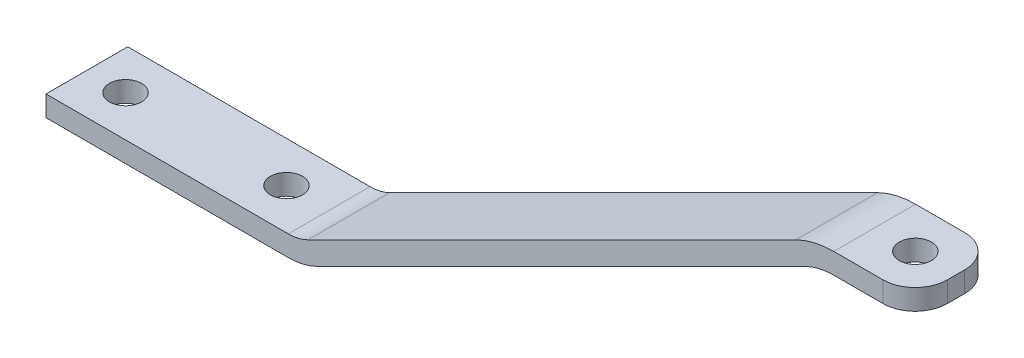
ISO-10303-21;
HEADER;
FILE_DESCRIPTION(('STEP AP214'),'2;1');
FILE_NAME('part.step','',(''),(''),'','','');
FILE_SCHEMA(('AUTOMOTIVE_DESIGN { 1 0 10303 214 1 1 1 1 }'));
ENDSEC;
DATA;
#1=APPLICATION_CONTEXT('core data for automotive mechanical design processes');
#2=APPLICATION_PROTOCOL_DEFINITION('international standard','automotive_design',2000,#1);
#3=PRODUCT_CONTEXT('',#1,'mechanical');
#4=PRODUCT('Part','Part','',(#3));
#5=PRODUCT_RELATED_PRODUCT_CATEGORY('part','',(#4));
#6=PRODUCT_DEFINITION_FORMATION('','',#4);
#7=PRODUCT_DEFINITION_CONTEXT('part definition',#1,'design');
#8=PRODUCT_DEFINITION('design','',#6,#7);
#9=PRODUCT_DEFINITION_SHAPE('','',#8);
#10=(LENGTH_UNIT() NAMED_UNIT(*) SI_UNIT(.MILLI.,.METRE.));
#11=(NAMED_UNIT(*) PLANE_ANGLE_UNIT() SI_UNIT($,.RADIAN.));
#12=(NAMED_UNIT(*) SI_UNIT($,.STERADIAN.) SOLID_ANGLE_UNIT());
#13=UNCERTAINTY_MEASURE_WITH_UNIT(LENGTH_MEASURE(1.E-05),#10,'distance_accuracy_value','');
#14=(GEOMETRIC_REPRESENTATION_CONTEXT(3) GLOBAL_UNCERTAINTY_ASSIGNED_CONTEXT((#13)) GLOBAL_UNIT_ASSIGNED_CONTEXT((#10,
#11,#12)) REPRESENTATION_CONTEXT('',''));
#15=CARTESIAN_POINT('',(0.,0.,0.));
#16=DIRECTION('',(0.,0.,1.));
#17=DIRECTION('',(1.,0.,0.));
#18=AXIS2_PLACEMENT_3D('',#15,#16,#17);
#19=CARTESIAN_POINT('',(0.,0.,12.7));
#20=DIRECTION('',(-1.,0.,0.));
#21=DIRECTION('',(0.,0.,1.));
#22=AXIS2_PLACEMENT_3D('',#19,#20,#21);
#23=PLANE('',#22);
#24=DIRECTION('',(0.,1.,0.));
#25=VECTOR('',#24,1.);
#26=CARTESIAN_POINT('',(0.,0.,0.));
#27=LINE('',#26,#25);
#28=CARTESIAN_POINT('',(0.,0.,0.));
#29=VERTEX_POINT('',#28);
#30=CARTESIAN_POINT('',(0.,3.2,0.));
#31=VERTEX_POINT('',#30);
#32=EDGE_CURVE('E191',#29,#31,#27,.T.);
#33=ORIENTED_EDGE('',*,*,#32,.F.);
#34=DIRECTION('',(0.,0.,-1.));
#35=VECTOR('',#34,1.);
#36=CARTESIAN_POINT('',(0.,0.,12.7));
#37=LINE('',#36,#35);
#38=CARTESIAN_POINT('',(0.,0.,12.7));
#39=VERTEX_POINT('',#38);
#40=EDGE_CURVE('E160',#39,#29,#37,.T.);
#41=ORIENTED_EDGE('',*,*,#40,.F.);
#42=DIRECTION('',(0.,1.,0.));
#43=VECTOR('',#42,1.);
#44=CARTESIAN_POINT('',(0.,0.,12.7));
#45=LINE('',#44,#43);
#46=CARTESIAN_POINT('',(0.,3.2,12.7));
#47=VERTEX_POINT('',#46);
#48=EDGE_CURVE('E154',#39,#47,#45,.T.);
#49=ORIENTED_EDGE('',*,*,#48,.T.);
#50=DIRECTION('',(0.,0.,-1.));
#51=VECTOR('',#50,1.);
#52=CARTESIAN_POINT('',(0.,3.2,12.7));
#53=LINE('',#52,#51);
#54=EDGE_CURVE('E137',#47,#31,#53,.T.);
#55=ORIENTED_EDGE('',*,*,#54,.T.);
#56=EDGE_LOOP('',(#33,#41,#49,#55));
#57=FACE_BOUND('',#56,.T.);
#58=ADVANCED_FACE('F36',(#57),#23,.T.);
#59=CARTESIAN_POINT('',(0.,0.,12.7));
#60=DIRECTION('',(0.,1.,0.));
#61=DIRECTION('',(0.,0.,1.));
#62=AXIS2_PLACEMENT_3D('',#59,#60,#61);
#63=PLANE('',#62);
#64=CARTESIAN_POINT('',(31.,0.,6.35));
#65=DIRECTION('',(0.,1.,0.));
#66=DIRECTION('',(0.,0.,1.));
#67=AXIS2_PLACEMENT_3D('',#64,#65,#66);
#68=CIRCLE('',#67,2.49999999999999);
#69=CARTESIAN_POINT('',(31.,0.,8.84999999999999));
#70=VERTEX_POINT('',#69);
#71=EDGE_CURVE('E193',#70,#70,#68,.T.);
#72=ORIENTED_EDGE('',*,*,#71,.T.);
#73=EDGE_LOOP('',(#72));
#74=FACE_BOUND('',#73,.T.);
#75=CARTESIAN_POINT('',(6.,0.,6.35));
#76=DIRECTION('',(0.,1.,0.));
#77=DIRECTION('',(0.,0.,1.));
#78=AXIS2_PLACEMENT_3D('',#75,#76,#77);
#79=CIRCLE('',#78,2.5);
#80=CARTESIAN_POINT('',(6.,0.,8.85));
#81=VERTEX_POINT('',#80);
#82=EDGE_CURVE('E344',#81,#81,#79,.T.);
#83=ORIENTED_EDGE('',*,*,#82,.T.);
#84=EDGE_LOOP('',(#83));
#85=FACE_BOUND('',#84,.T.);
#86=DIRECTION('',(1.,0.,0.));
#87=VECTOR('',#86,1.);
#88=CARTESIAN_POINT('',(0.,0.,0.));
#89=LINE('',#88,#87);
#90=CARTESIAN_POINT('',(37.6393202250021,0.,0.));
#91=VERTEX_POINT('',#90);
#92=EDGE_CURVE('E162',#29,#91,#89,.T.);
#93=ORIENTED_EDGE('',*,*,#92,.T.);
#94=DIRECTION('',(0.,0.,-1.));
#95=VECTOR('',#94,1.);
#96=CARTESIAN_POINT('',(37.6393202250021,0.,12.7));
#97=LINE('',#96,#95);
#98=CARTESIAN_POINT('',(37.6393202250021,0.,12.7));
#99=VERTEX_POINT('',#98);
#100=EDGE_CURVE('E216',#99,#91,#97,.T.);
#101=ORIENTED_EDGE('',*,*,#100,.F.);
#102=DIRECTION('',(1.,0.,0.));
#103=VECTOR('',#102,1.);
#104=CARTESIAN_POINT('',(0.,0.,12.7));
#105=LINE('',#104,#103);
#106=EDGE_CURVE('E148',#39,#99,#105,.T.);
#107=ORIENTED_EDGE('',*,*,#106,.F.);
#108=ORIENTED_EDGE('',*,*,#40,.T.);
#109=EDGE_LOOP('',(#93,#101,#107,#108));
#110=FACE_BOUND('',#109,.T.);
#111=ADVANCED_FACE('F275',(#74,#85,#110),#63,.F.);
#112=CARTESIAN_POINT('',(37.6393202250021,10.,12.7));
#113=DIRECTION('',(0.,0.,-1.));
#114=DIRECTION('',(-1.,0.,0.));
#115=AXIS2_PLACEMENT_3D('',#112,#113,#114);
#116=CYLINDRICAL_SURFACE('',#115,10.);
#117=CARTESIAN_POINT('',(37.6393202250021,10.,0.));
#118=DIRECTION('',(0.,0.,-1.));
#119=DIRECTION('',(-1.,0.,0.));
#120=AXIS2_PLACEMENT_3D('',#117,#118,#119);
#121=CIRCLE('',#120,10.);
#122=CARTESIAN_POINT('',(42.1114561800017,1.05572809000086,0.));
#123=VERTEX_POINT('',#122);
#124=EDGE_CURVE('E165',#123,#91,#121,.T.);
#125=ORIENTED_EDGE('',*,*,#124,.F.);
#126=DIRECTION('',(0.,0.,-1.));
#127=VECTOR('',#126,1.);
#128=CARTESIAN_POINT('',(42.1114561800017,1.05572809000086,12.7));
#129=LINE('',#128,#127);
#130=CARTESIAN_POINT('',(42.1114561800017,1.05572809000086,12.7));
#131=VERTEX_POINT('',#130);
#132=EDGE_CURVE('E218',#131,#123,#129,.T.);
#133=ORIENTED_EDGE('',*,*,#132,.F.);
#134=CARTESIAN_POINT('',(37.6393202250021,10.,12.7));
#135=DIRECTION('',(0.,0.,-1.));
#136=DIRECTION('',(-1.,0.,0.));
#137=AXIS2_PLACEMENT_3D('',#134,#135,#136);
#138=CIRCLE('',#137,10.);
#139=EDGE_CURVE('E187',#131,#99,#138,.T.);
#140=ORIENTED_EDGE('',*,*,#139,.T.);
#141=ORIENTED_EDGE('',*,*,#100,.T.);
#142=EDGE_LOOP('',(#125,#133,#140,#141));
#143=FACE_BOUND('',#142,.T.);
#144=ADVANCED_FACE('F280',(#143),#116,.T.);
#145=CARTESIAN_POINT('',(42.1114561800017,1.05572809000086,12.7));
#146=DIRECTION('',(-0.447213595499958,0.894427190999916,0.));
#147=DIRECTION('',(-0.894427190999916,-0.447213595499958,0.));
#148=AXIS2_PLACEMENT_3D('',#145,#146,#147);
#149=PLANE('',#148);
#150=DIRECTION('',(0.894427190999916,0.447213595499958,0.));
#151=VECTOR('',#150,1.);
#152=CARTESIAN_POINT('',(42.1114561800017,1.05572809000086,0.));
#153=LINE('',#152,#151);
#154=CARTESIAN_POINT('',(117.888543819998,38.9442719099991,0.));
#155=VERTEX_POINT('',#154);
#156=EDGE_CURVE('E210',#123,#155,#153,.T.);
#157=ORIENTED_EDGE('',*,*,#156,.T.);
#158=DIRECTION('',(0.,0.,-1.));
#159=VECTOR('',#158,1.);
#160=CARTESIAN_POINT('',(117.888543819998,38.9442719099991,12.7));
#161=LINE('',#160,#159);
#162=CARTESIAN_POINT('',(117.888543819998,38.9442719099991,12.7));
#163=VERTEX_POINT('',#162);
#164=EDGE_CURVE('E220',#163,#155,#161,.T.);
#165=ORIENTED_EDGE('',*,*,#164,.F.);
#166=DIRECTION('',(0.894427190999916,0.447213595499958,0.));
#167=VECTOR('',#166,1.);
#168=CARTESIAN_POINT('',(42.1114561800017,1.05572809000086,12.7));
#169=LINE('',#168,#167);
#170=EDGE_CURVE('E185',#131,#163,#169,.T.);
#171=ORIENTED_EDGE('',*,*,#170,.F.);
#172=ORIENTED_EDGE('',*,*,#132,.T.);
#173=EDGE_LOOP('',(#157,#165,#171,#172));
#174=FACE_BOUND('',#173,.T.);
#175=ADVANCED_FACE('F310',(#174),#149,.F.);
#176=CARTESIAN_POINT('',(122.360679774998,30.,12.7));
#177=DIRECTION('',(0.,0.,-1.));
#178=DIRECTION('',(-1.,0.,0.));
#179=AXIS2_PLACEMENT_3D('',#176,#177,#178);
#180=CYLINDRICAL_SURFACE('',#179,10.);
#181=CARTESIAN_POINT('',(122.360679774998,30.,0.));
#182=DIRECTION('',(0.,0.,-1.));
#183=DIRECTION('',(-1.,0.,0.));
#184=AXIS2_PLACEMENT_3D('',#181,#182,#183);
#185=CIRCLE('',#184,10.);
#186=CARTESIAN_POINT('',(122.360679774998,40.,0.));
#187=VERTEX_POINT('',#186);
#188=EDGE_CURVE('E208',#155,#187,#185,.T.);
#189=ORIENTED_EDGE('',*,*,#188,.T.);
#190=DIRECTION('',(0.,0.,-1.));
#191=VECTOR('',#190,1.);
#192=CARTESIAN_POINT('',(122.360679774998,40.,12.7));
#193=LINE('',#192,#191);
#194=CARTESIAN_POINT('',(122.360679774998,40.,12.7));
#195=VERTEX_POINT('',#194);
#196=EDGE_CURVE('E223',#195,#187,#193,.T.);
#197=ORIENTED_EDGE('',*,*,#196,.F.);
#198=CARTESIAN_POINT('',(122.360679774998,30.,12.7));
#199=DIRECTION('',(0.,0.,-1.));
#200=DIRECTION('',(-1.,0.,0.));
#201=AXIS2_PLACEMENT_3D('',#198,#199,#200);
#202=CIRCLE('',#201,10.);
#203=EDGE_CURVE('E183',#163,#195,#202,.T.);
#204=ORIENTED_EDGE('',*,*,#203,.F.);
#205=ORIENTED_EDGE('',*,*,#164,.T.);
#206=EDGE_LOOP('',(#189,#197,#204,#205));
#207=FACE_BOUND('',#206,.T.);
#208=ADVANCED_FACE('F306',(#207),#180,.F.);
#209=CARTESIAN_POINT('',(122.360679774998,40.,12.7));
#210=DIRECTION('',(0.,1.,0.));
#211=DIRECTION('',(0.,0.,1.));
#212=AXIS2_PLACEMENT_3D('',#209,#210,#211);
#213=PLANE('',#212);
#214=CARTESIAN_POINT('',(128.680339887499,40.,6.35));
#215=DIRECTION('',(0.,1.,0.));
#216=DIRECTION('',(0.,0.,1.));
#217=AXIS2_PLACEMENT_3D('',#214,#215,#216);
#218=CIRCLE('',#217,2.5);
#219=CARTESIAN_POINT('',(128.680339887499,40.,8.84999999999999));
#220=VERTEX_POINT('',#219);
#221=EDGE_CURVE('E341',#220,#220,#218,.T.);
#222=ORIENTED_EDGE('',*,*,#221,.T.);
#223=EDGE_LOOP('',(#222));
#224=FACE_BOUND('',#223,.T.);
#225=DIRECTION('',(1.,0.,0.));
#226=VECTOR('',#225,1.);
#227=CARTESIAN_POINT('',(122.360679774998,40.,0.));
#228=LINE('',#227,#226);
#229=CARTESIAN_POINT('',(130.,40.,0.));
#230=VERTEX_POINT('',#229);
#231=EDGE_CURVE('E206',#187,#230,#228,.T.);
#232=ORIENTED_EDGE('',*,*,#231,.T.);
#233=CARTESIAN_POINT('',(130.,40.,5.));
#234=DIRECTION('',(0.,1.,0.));
#235=DIRECTION('',(0.,0.,1.));
#236=AXIS2_PLACEMENT_3D('',#233,#234,#235);
#237=CIRCLE('',#236,5.);
#238=CARTESIAN_POINT('',(135.,40.,5.));
#239=VERTEX_POINT('',#238);
#240=EDGE_CURVE('E11',#230,#239,#237,.F.);
#241=ORIENTED_EDGE('',*,*,#240,.T.);
#242=DIRECTION('',(0.,0.,-1.));
#243=VECTOR('',#242,1.);
#244=CARTESIAN_POINT('',(135.,40.,12.7));
#245=LINE('',#244,#243);
#246=CARTESIAN_POINT('',(135.,40.,7.7));
#247=VERTEX_POINT('',#246);
#248=EDGE_CURVE('E226',#247,#239,#245,.T.);
#249=ORIENTED_EDGE('',*,*,#248,.F.);
#250=CARTESIAN_POINT('',(130.,40.,7.7));
#251=DIRECTION('',(0.,1.,0.));
#252=DIRECTION('',(0.,0.,1.));
#253=AXIS2_PLACEMENT_3D('',#250,#251,#252);
#254=CIRCLE('',#253,5.);
#255=CARTESIAN_POINT('',(130.,40.,12.7));
#256=VERTEX_POINT('',#255);
#257=EDGE_CURVE('E244',#247,#256,#254,.F.);
#258=ORIENTED_EDGE('',*,*,#257,.T.);
#259=DIRECTION('',(1.,0.,0.));
#260=VECTOR('',#259,1.);
#261=CARTESIAN_POINT('',(122.360679774998,40.,12.7));
#262=LINE('',#261,#260);
#263=EDGE_CURVE('E181',#195,#256,#262,.T.);
#264=ORIENTED_EDGE('',*,*,#263,.F.);
#265=ORIENTED_EDGE('',*,*,#196,.T.);
#266=EDGE_LOOP('',(#232,#241,#249,#258,#264,#265));
#267=FACE_BOUND('',#266,.T.);
#268=ADVANCED_FACE('F268',(#224,#267),#213,.F.);
#269=CARTESIAN_POINT('',(135.,40.,12.7));
#270=DIRECTION('',(-1.,0.,0.));
#271=DIRECTION('',(0.,0.,1.));
#272=AXIS2_PLACEMENT_3D('',#269,#270,#271);
#273=PLANE('',#272);
#274=ORIENTED_EDGE('',*,*,#248,.T.);
#275=DIRECTION('',(0.,1.,0.));
#276=VECTOR('',#275,1.);
#277=CARTESIAN_POINT('',(135.,43.2,5.));
#278=LINE('',#277,#276);
#279=CARTESIAN_POINT('',(135.,43.2,5.));
#280=VERTEX_POINT('',#279);
#281=EDGE_CURVE('E246',#239,#280,#278,.T.);
#282=ORIENTED_EDGE('',*,*,#281,.T.);
#283=DIRECTION('',(0.,0.,-1.));
#284=VECTOR('',#283,1.);
#285=CARTESIAN_POINT('',(135.,43.2,12.7));
#286=LINE('',#285,#284);
#287=CARTESIAN_POINT('',(135.,43.2,7.7));
#288=VERTEX_POINT('',#287);
#289=EDGE_CURVE('E229',#288,#280,#286,.T.);
#290=ORIENTED_EDGE('',*,*,#289,.F.);
#291=DIRECTION('',(0.,1.,0.));
#292=VECTOR('',#291,1.);
#293=CARTESIAN_POINT('',(135.,40.,7.7));
#294=LINE('',#293,#292);
#295=EDGE_CURVE('E242',#288,#247,#294,.F.);
#296=ORIENTED_EDGE('',*,*,#295,.T.);
#297=EDGE_LOOP('',(#274,#282,#290,#296));
#298=FACE_BOUND('',#297,.T.);
#299=ADVANCED_FACE('F252',(#298),#273,.F.);
#300=CARTESIAN_POINT('',(122.360679774998,43.2,12.7));
#301=DIRECTION('',(0.,1.,0.));
#302=DIRECTION('',(0.,0.,1.));
#303=AXIS2_PLACEMENT_3D('',#300,#301,#302);
#304=PLANE('',#303);
#305=CARTESIAN_POINT('',(128.680339887499,43.2,6.35));
#306=DIRECTION('',(0.,1.,0.));
#307=DIRECTION('',(0.,0.,1.));
#308=AXIS2_PLACEMENT_3D('',#305,#306,#307);
#309=CIRCLE('',#308,2.5);
#310=CARTESIAN_POINT('',(128.680339887499,43.2,8.84999999999999));
#311=VERTEX_POINT('',#310);
#312=EDGE_CURVE('E338',#311,#311,#309,.T.);
#313=ORIENTED_EDGE('',*,*,#312,.F.);
#314=EDGE_LOOP('',(#313));
#315=FACE_BOUND('',#314,.T.);
#316=ORIENTED_EDGE('',*,*,#289,.T.);
#317=CARTESIAN_POINT('',(130.,43.2,5.));
#318=DIRECTION('',(0.,1.,0.));
#319=DIRECTION('',(0.,0.,1.));
#320=AXIS2_PLACEMENT_3D('',#317,#318,#319);
#321=CIRCLE('',#320,5.);
#322=CARTESIAN_POINT('',(130.,43.2,0.));
#323=VERTEX_POINT('',#322);
#324=EDGE_CURVE('E58',#280,#323,#321,.T.);
#325=ORIENTED_EDGE('',*,*,#324,.T.);
#326=DIRECTION('',(1.,0.,0.));
#327=VECTOR('',#326,1.);
#328=CARTESIAN_POINT('',(122.360679774998,43.2,0.));
#329=LINE('',#328,#327);
#330=CARTESIAN_POINT('',(122.360679774998,43.2,0.));
#331=VERTEX_POINT('',#330);
#332=EDGE_CURVE('E204',#331,#323,#329,.T.);
#333=ORIENTED_EDGE('',*,*,#332,.F.);
#334=DIRECTION('',(0.,0.,-1.));
#335=VECTOR('',#334,1.);
#336=CARTESIAN_POINT('',(122.360679774998,43.2,12.7));
#337=LINE('',#336,#335);
#338=CARTESIAN_POINT('',(122.360679774998,43.2,12.7));
#339=VERTEX_POINT('',#338);
#340=EDGE_CURVE('E231',#339,#331,#337,.T.);
#341=ORIENTED_EDGE('',*,*,#340,.F.);
#342=DIRECTION('',(1.,0.,0.));
#343=VECTOR('',#342,1.);
#344=CARTESIAN_POINT('',(122.360679774998,43.2,12.7));
#345=LINE('',#344,#343);
#346=CARTESIAN_POINT('',(130.,43.2,12.7));
#347=VERTEX_POINT('',#346);
#348=EDGE_CURVE('E178',#339,#347,#345,.T.);
#349=ORIENTED_EDGE('',*,*,#348,.T.);
#350=CARTESIAN_POINT('',(130.,43.2,7.7));
#351=DIRECTION('',(0.,1.,0.));
#352=DIRECTION('',(0.,0.,1.));
#353=AXIS2_PLACEMENT_3D('',#350,#351,#352);
#354=CIRCLE('',#353,5.);
#355=EDGE_CURVE('E240',#347,#288,#354,.T.);
#356=ORIENTED_EDGE('',*,*,#355,.T.);
#357=EDGE_LOOP('',(#316,#325,#333,#341,#349,#356));
#358=FACE_BOUND('',#357,.T.);
#359=ADVANCED_FACE('F257',(#315,#358),#304,.T.);
#360=CARTESIAN_POINT('',(122.360679774998,30.,12.7));
#361=DIRECTION('',(0.,0.,-1.));
#362=DIRECTION('',(-1.,0.,0.));
#363=AXIS2_PLACEMENT_3D('',#360,#361,#362);
#364=CYLINDRICAL_SURFACE('',#363,13.2);
#365=CARTESIAN_POINT('',(122.360679774998,30.,0.));
#366=DIRECTION('',(0.,0.,-1.));
#367=DIRECTION('',(-1.,0.,0.));
#368=AXIS2_PLACEMENT_3D('',#365,#366,#367);
#369=CIRCLE('',#368,13.2);
#370=CARTESIAN_POINT('',(116.457460314398,41.8064389211989,0.));
#371=VERTEX_POINT('',#370);
#372=EDGE_CURVE('E201',#371,#331,#369,.T.);
#373=ORIENTED_EDGE('',*,*,#372,.F.);
#374=DIRECTION('',(0.,0.,-1.));
#375=VECTOR('',#374,1.);
#376=CARTESIAN_POINT('',(116.457460314398,41.8064389211989,12.7));
#377=LINE('',#376,#375);
#378=CARTESIAN_POINT('',(116.457460314398,41.8064389211989,12.7));
#379=VERTEX_POINT('',#378);
#380=EDGE_CURVE('E233',#379,#371,#377,.T.);
#381=ORIENTED_EDGE('',*,*,#380,.F.);
#382=CARTESIAN_POINT('',(122.360679774998,30.,12.7));
#383=DIRECTION('',(0.,0.,-1.));
#384=DIRECTION('',(-1.,0.,0.));
#385=AXIS2_PLACEMENT_3D('',#382,#383,#384);
#386=CIRCLE('',#385,13.2);
#387=EDGE_CURVE('E175',#379,#339,#386,.T.);
#388=ORIENTED_EDGE('',*,*,#387,.T.);
#389=ORIENTED_EDGE('',*,*,#340,.T.);
#390=EDGE_LOOP('',(#373,#381,#388,#389));
#391=FACE_BOUND('',#390,.T.);
#392=ADVANCED_FACE('F294',(#391),#364,.T.);
#393=CARTESIAN_POINT('',(40.6803726744018,3.91789510120059,12.7));
#394=DIRECTION('',(-0.447213595499958,0.894427190999916,0.));
#395=DIRECTION('',(-0.894427190999916,-0.447213595499958,0.));
#396=AXIS2_PLACEMENT_3D('',#393,#394,#395);
#397=PLANE('',#396);
#398=DIRECTION('',(0.894427190999916,0.447213595499958,0.));
#399=VECTOR('',#398,1.);
#400=CARTESIAN_POINT('',(40.6803726744018,3.91789510120059,0.));
#401=LINE('',#400,#399);
#402=CARTESIAN_POINT('',(40.6803726744018,3.91789510120059,0.));
#403=VERTEX_POINT('',#402);
#404=EDGE_CURVE('E198',#403,#371,#401,.T.);
#405=ORIENTED_EDGE('',*,*,#404,.F.);
#406=DIRECTION('',(0.,0.,-1.));
#407=VECTOR('',#406,1.);
#408=CARTESIAN_POINT('',(40.6803726744018,3.91789510120059,12.7));
#409=LINE('',#408,#407);
#410=CARTESIAN_POINT('',(40.6803726744018,3.91789510120059,12.7));
#411=VERTEX_POINT('',#410);
#412=EDGE_CURVE('E235',#411,#403,#409,.T.);
#413=ORIENTED_EDGE('',*,*,#412,.F.);
#414=DIRECTION('',(0.894427190999916,0.447213595499958,0.));
#415=VECTOR('',#414,1.);
#416=CARTESIAN_POINT('',(40.6803726744018,3.91789510120059,12.7));
#417=LINE('',#416,#415);
#418=EDGE_CURVE('E172',#411,#379,#417,.T.);
#419=ORIENTED_EDGE('',*,*,#418,.T.);
#420=ORIENTED_EDGE('',*,*,#380,.T.);
#421=EDGE_LOOP('',(#405,#413,#419,#420));
#422=FACE_BOUND('',#421,.T.);
#423=ADVANCED_FACE('F290',(#422),#397,.T.);
#424=CARTESIAN_POINT('',(37.6393202250021,10.,12.7));
#425=DIRECTION('',(0.,0.,-1.));
#426=DIRECTION('',(-1.,0.,0.));
#427=AXIS2_PLACEMENT_3D('',#424,#425,#426);
#428=CYLINDRICAL_SURFACE('',#427,6.8);
#429=CARTESIAN_POINT('',(37.6393202250021,10.,0.));
#430=DIRECTION('',(0.,0.,-1.));
#431=DIRECTION('',(-1.,0.,0.));
#432=AXIS2_PLACEMENT_3D('',#429,#430,#431);
#433=CIRCLE('',#432,6.8);
#434=CARTESIAN_POINT('',(37.6393202250021,3.2,0.));
#435=VERTEX_POINT('',#434);
#436=EDGE_CURVE('E195',#403,#435,#433,.T.);
#437=ORIENTED_EDGE('',*,*,#436,.T.);
#438=DIRECTION('',(0.,0.,-1.));
#439=VECTOR('',#438,1.);
#440=CARTESIAN_POINT('',(37.6393202250021,3.2,12.7));
#441=LINE('',#440,#439);
#442=CARTESIAN_POINT('',(37.6393202250021,3.2,12.7));
#443=VERTEX_POINT('',#442);
#444=EDGE_CURVE('E147',#443,#435,#441,.T.);
#445=ORIENTED_EDGE('',*,*,#444,.F.);
#446=CARTESIAN_POINT('',(37.6393202250021,10.,12.7));
#447=DIRECTION('',(0.,0.,-1.));
#448=DIRECTION('',(-1.,0.,0.));
#449=AXIS2_PLACEMENT_3D('',#446,#447,#448);
#450=CIRCLE('',#449,6.8);
#451=EDGE_CURVE('E157',#411,#443,#450,.T.);
#452=ORIENTED_EDGE('',*,*,#451,.F.);
#453=ORIENTED_EDGE('',*,*,#412,.T.);
#454=EDGE_LOOP('',(#437,#445,#452,#453));
#455=FACE_BOUND('',#454,.T.);
#456=ADVANCED_FACE('F286',(#455),#428,.F.);
#457=CARTESIAN_POINT('',(0.,3.2,12.7));
#458=DIRECTION('',(0.,1.,0.));
#459=DIRECTION('',(0.,0.,1.));
#460=AXIS2_PLACEMENT_3D('',#457,#458,#459);
#461=PLANE('',#460);
#462=CARTESIAN_POINT('',(31.,3.2,6.35));
#463=DIRECTION('',(0.,1.,0.));
#464=DIRECTION('',(0.,0.,1.));
#465=AXIS2_PLACEMENT_3D('',#462,#463,#464);
#466=CIRCLE('',#465,2.49999999999999);
#467=CARTESIAN_POINT('',(31.,3.2,8.84999999999999));
#468=VERTEX_POINT('',#467);
#469=EDGE_CURVE('E349',#468,#468,#466,.T.);
#470=ORIENTED_EDGE('',*,*,#469,.F.);
#471=EDGE_LOOP('',(#470));
#472=FACE_BOUND('',#471,.T.);
#473=CARTESIAN_POINT('',(6.,3.2,6.35));
#474=DIRECTION('',(0.,1.,0.));
#475=DIRECTION('',(0.,0.,1.));
#476=AXIS2_PLACEMENT_3D('',#473,#474,#475);
#477=CIRCLE('',#476,2.5);
#478=CARTESIAN_POINT('',(6.,3.2,8.85));
#479=VERTEX_POINT('',#478);
#480=EDGE_CURVE('E168',#479,#479,#477,.T.);
#481=ORIENTED_EDGE('',*,*,#480,.F.);
#482=EDGE_LOOP('',(#481));
#483=FACE_BOUND('',#482,.T.);
#484=DIRECTION('',(1.,0.,0.));
#485=VECTOR('',#484,1.);
#486=CARTESIAN_POINT('',(0.,3.2,0.));
#487=LINE('',#486,#485);
#488=EDGE_CURVE('E142',#31,#435,#487,.T.);
#489=ORIENTED_EDGE('',*,*,#488,.F.);
#490=ORIENTED_EDGE('',*,*,#54,.F.);
#491=DIRECTION('',(1.,0.,0.));
#492=VECTOR('',#491,1.);
#493=CARTESIAN_POINT('',(0.,3.2,12.7));
#494=LINE('',#493,#492);
#495=EDGE_CURVE('E140',#47,#443,#494,.T.);
#496=ORIENTED_EDGE('',*,*,#495,.T.);
#497=ORIENTED_EDGE('',*,*,#444,.T.);
#498=EDGE_LOOP('',(#489,#490,#496,#497));
#499=FACE_BOUND('',#498,.T.);
#500=ADVANCED_FACE('F139',(#472,#483,#499),#461,.T.);
#501=CARTESIAN_POINT('',(37.6393202250021,10.,12.7));
#502=DIRECTION('',(0.,0.,-1.));
#503=DIRECTION('',(-1.,0.,0.));
#504=AXIS2_PLACEMENT_3D('',#501,#502,#503);
#505=PLANE('',#504);
#506=ORIENTED_EDGE('',*,*,#263,.T.);
#507=DIRECTION('',(0.,1.,0.));
#508=VECTOR('',#507,1.);
#509=CARTESIAN_POINT('',(130.,10.,12.7));
#510=LINE('',#509,#508);
#511=EDGE_CURVE('E215',#256,#347,#510,.T.);
#512=ORIENTED_EDGE('',*,*,#511,.T.);
#513=ORIENTED_EDGE('',*,*,#348,.F.);
#514=ORIENTED_EDGE('',*,*,#387,.F.);
#515=ORIENTED_EDGE('',*,*,#418,.F.);
#516=ORIENTED_EDGE('',*,*,#451,.T.);
#517=ORIENTED_EDGE('',*,*,#495,.F.);
#518=ORIENTED_EDGE('',*,*,#48,.F.);
#519=ORIENTED_EDGE('',*,*,#106,.T.);
#520=ORIENTED_EDGE('',*,*,#139,.F.);
#521=ORIENTED_EDGE('',*,*,#170,.T.);
#522=ORIENTED_EDGE('',*,*,#203,.T.);
#523=EDGE_LOOP('',(#506,#512,#513,#514,#515,#516,#517,#518,#519,#520,#521,#522));
#524=FACE_BOUND('',#523,.T.);
#525=ADVANCED_FACE('F153',(#524),#505,.F.);
#526=CARTESIAN_POINT('',(37.6393202250021,10.,0.));
#527=DIRECTION('',(0.,0.,-1.));
#528=DIRECTION('',(-1.,0.,0.));
#529=AXIS2_PLACEMENT_3D('',#526,#527,#528);
#530=PLANE('',#529);
#531=ORIENTED_EDGE('',*,*,#332,.T.);
#532=DIRECTION('',(0.,1.,0.));
#533=VECTOR('',#532,1.);
#534=CARTESIAN_POINT('',(130.,40.,0.));
#535=LINE('',#534,#533);
#536=EDGE_CURVE('E44',#323,#230,#535,.F.);
#537=ORIENTED_EDGE('',*,*,#536,.T.);
#538=ORIENTED_EDGE('',*,*,#231,.F.);
#539=ORIENTED_EDGE('',*,*,#188,.F.);
#540=ORIENTED_EDGE('',*,*,#156,.F.);
#541=ORIENTED_EDGE('',*,*,#124,.T.);
#542=ORIENTED_EDGE('',*,*,#92,.F.);
#543=ORIENTED_EDGE('',*,*,#32,.T.);
#544=ORIENTED_EDGE('',*,*,#488,.T.);
#545=ORIENTED_EDGE('',*,*,#436,.F.);
#546=ORIENTED_EDGE('',*,*,#404,.T.);
#547=ORIENTED_EDGE('',*,*,#372,.T.);
#548=EDGE_LOOP('',(#531,#537,#538,#539,#540,#541,#542,#543,#544,#545,#546,#547));
#549=FACE_BOUND('',#548,.T.);
#550=ADVANCED_FACE('F318',(#549),#530,.T.);
#551=CARTESIAN_POINT('',(6.,0.,6.35));
#552=DIRECTION('',(0.,1.,0.));
#553=DIRECTION('',(0.,0.,1.));
#554=AXIS2_PLACEMENT_3D('',#551,#552,#553);
#555=CYLINDRICAL_SURFACE('',#554,2.5);
#556=ORIENTED_EDGE('',*,*,#82,.F.);
#557=EDGE_LOOP('',(#556));
#558=FACE_BOUND('',#557,.T.);
#559=ORIENTED_EDGE('',*,*,#480,.T.);
#560=EDGE_LOOP('',(#559));
#561=FACE_BOUND('',#560,.T.);
#562=ADVANCED_FACE('F321',(#558,#561),#555,.F.);
#563=CARTESIAN_POINT('',(31.,0.,6.35));
#564=DIRECTION('',(0.,1.,0.));
#565=DIRECTION('',(0.,0.,1.));
#566=AXIS2_PLACEMENT_3D('',#563,#564,#565);
#567=CYLINDRICAL_SURFACE('',#566,2.49999999999999);
#568=ORIENTED_EDGE('',*,*,#71,.F.);
#569=EDGE_LOOP('',(#568));
#570=FACE_BOUND('',#569,.T.);
#571=ORIENTED_EDGE('',*,*,#469,.T.);
#572=EDGE_LOOP('',(#571));
#573=FACE_BOUND('',#572,.T.);
#574=ADVANCED_FACE('F326',(#570,#573),#567,.F.);
#575=CARTESIAN_POINT('',(128.680339887499,0.,6.35));
#576=DIRECTION('',(0.,1.,0.));
#577=DIRECTION('',(0.,0.,1.));
#578=AXIS2_PLACEMENT_3D('',#575,#576,#577);
#579=CYLINDRICAL_SURFACE('',#578,2.5);
#580=CARTESIAN_POINT('',(128.680339887499,43.2,8.84999999999999));
#581=CARTESIAN_POINT('',(128.680339887499,43.1666666666667,8.84999999999999));
#582=CARTESIAN_POINT('',(128.680339887499,43.1333333333333,8.84999999999999));
#583=CARTESIAN_POINT('',(128.680339887499,43.0666666666667,8.84999999999999));
#584=CARTESIAN_POINT('',(128.680339887499,43.0333333333333,8.84999999999999));
#585=CARTESIAN_POINT('',(128.680339887499,42.9666666666667,8.84999999999999));
#586=CARTESIAN_POINT('',(128.680339887499,42.9333333333333,8.84999999999999));
#587=CARTESIAN_POINT('',(128.680339887499,42.8666666666667,8.84999999999999));
#588=CARTESIAN_POINT('',(128.680339887499,42.8333333333333,8.84999999999999));
#589=CARTESIAN_POINT('',(128.680339887499,42.7666666666667,8.84999999999999));
#590=CARTESIAN_POINT('',(128.680339887499,42.7333333333333,8.84999999999999));
#591=CARTESIAN_POINT('',(128.680339887499,42.6666666666667,8.84999999999999));
#592=CARTESIAN_POINT('',(128.680339887499,42.6333333333333,8.84999999999999));
#593=CARTESIAN_POINT('',(128.680339887499,42.5666666666667,8.84999999999999));
#594=CARTESIAN_POINT('',(128.680339887499,42.5333333333333,8.84999999999999));
#595=CARTESIAN_POINT('',(128.680339887499,42.4666666666667,8.84999999999999));
#596=CARTESIAN_POINT('',(128.680339887499,42.4333333333333,8.84999999999999));
#597=CARTESIAN_POINT('',(128.680339887499,42.3666666666667,8.84999999999999));
#598=CARTESIAN_POINT('',(128.680339887499,42.3333333333333,8.84999999999999));
#599=CARTESIAN_POINT('',(128.680339887499,42.2666666666667,8.84999999999999));
#600=CARTESIAN_POINT('',(128.680339887499,42.2333333333333,8.84999999999999));
#601=CARTESIAN_POINT('',(128.680339887499,42.1666666666667,8.84999999999999));
#602=CARTESIAN_POINT('',(128.680339887499,42.1333333333333,8.84999999999999));
#603=CARTESIAN_POINT('',(128.680339887499,42.0666666666667,8.84999999999999));
#604=CARTESIAN_POINT('',(128.680339887499,42.0333333333333,8.84999999999999));
#605=CARTESIAN_POINT('',(128.680339887499,41.9666666666667,8.84999999999999));
#606=CARTESIAN_POINT('',(128.680339887499,41.9333333333333,8.84999999999999));
#607=CARTESIAN_POINT('',(128.680339887499,41.8666666666667,8.84999999999999));
#608=CARTESIAN_POINT('',(128.680339887499,41.8333333333333,8.84999999999999));
#609=CARTESIAN_POINT('',(128.680339887499,41.7666666666667,8.84999999999999));
#610=CARTESIAN_POINT('',(128.680339887499,41.7333333333333,8.84999999999999));
#611=CARTESIAN_POINT('',(128.680339887499,41.6666666666667,8.84999999999999));
#612=CARTESIAN_POINT('',(128.680339887499,41.6333333333333,8.84999999999999));
#613=CARTESIAN_POINT('',(128.680339887499,41.5666666666667,8.84999999999999));
#614=CARTESIAN_POINT('',(128.680339887499,41.5333333333333,8.84999999999999));
#615=CARTESIAN_POINT('',(128.680339887499,41.4666666666667,8.84999999999999));
#616=CARTESIAN_POINT('',(128.680339887499,41.4333333333333,8.84999999999999));
#617=CARTESIAN_POINT('',(128.680339887499,41.3666666666667,8.84999999999999));
#618=CARTESIAN_POINT('',(128.680339887499,41.3333333333333,8.84999999999999));
#619=CARTESIAN_POINT('',(128.680339887499,41.2666666666667,8.84999999999999));
#620=CARTESIAN_POINT('',(128.680339887499,41.2333333333333,8.84999999999999));
#621=CARTESIAN_POINT('',(128.680339887499,41.1666666666667,8.84999999999999));
#622=CARTESIAN_POINT('',(128.680339887499,41.1333333333333,8.84999999999999));
#623=CARTESIAN_POINT('',(128.680339887499,41.0666666666667,8.84999999999999));
#624=CARTESIAN_POINT('',(128.680339887499,41.0333333333333,8.84999999999999));
#625=CARTESIAN_POINT('',(128.680339887499,40.9666666666667,8.84999999999999));
#626=CARTESIAN_POINT('',(128.680339887499,40.9333333333333,8.84999999999999));
#627=CARTESIAN_POINT('',(128.680339887499,40.8666666666667,8.84999999999999));
#628=CARTESIAN_POINT('',(128.680339887499,40.8333333333333,8.84999999999999));
#629=CARTESIAN_POINT('',(128.680339887499,40.7666666666667,8.84999999999999));
#630=CARTESIAN_POINT('',(128.680339887499,40.7333333333333,8.84999999999999));
#631=CARTESIAN_POINT('',(128.680339887499,40.6666666666667,8.84999999999999));
#632=CARTESIAN_POINT('',(128.680339887499,40.6333333333333,8.84999999999999));
#633=CARTESIAN_POINT('',(128.680339887499,40.5666666666667,8.84999999999999));
#634=CARTESIAN_POINT('',(128.680339887499,40.5333333333333,8.84999999999999));
#635=CARTESIAN_POINT('',(128.680339887499,40.4666666666667,8.84999999999999));
#636=CARTESIAN_POINT('',(128.680339887499,40.4333333333333,8.84999999999999));
#637=CARTESIAN_POINT('',(128.680339887499,40.3666666666667,8.84999999999999));
#638=CARTESIAN_POINT('',(128.680339887499,40.3333333333333,8.84999999999999));
#639=CARTESIAN_POINT('',(128.680339887499,40.2666666666667,8.84999999999999));
#640=CARTESIAN_POINT('',(128.680339887499,40.2333333333333,8.84999999999999));
#641=CARTESIAN_POINT('',(128.680339887499,40.1666666666667,8.84999999999999));
#642=CARTESIAN_POINT('',(128.680339887499,40.1333333333333,8.84999999999999));
#643=CARTESIAN_POINT('',(128.680339887499,40.0666666666667,8.84999999999999));
#644=CARTESIAN_POINT('',(128.680339887499,40.0333333333333,8.84999999999999));
#645=CARTESIAN_POINT('',(128.680339887499,40.,8.84999999999999));
#646=B_SPLINE_CURVE_WITH_KNOTS('',3,(#580,#581,#582,#583,#584,#585,#586,#587,#588,#589,#590,
#591,#592,#593,#594,#595,#596,#597,#598,#599,#600,#601,#602,#603,#604,#605,#606,#607,#608,#609,
#610,#611,#612,#613,#614,#615,#616,#617,#618,#619,#620,#621,#622,#623,#624,#625,#626,#627,#628,
#629,#630,#631,#632,#633,#634,#635,#636,#637,#638,#639,#640,#641,#642,#643,#644,#645),
.UNSPECIFIED.,.F.,.F.,(4,2,2,2,2,2,2,2,2,2,2,2,2,2,2,2,2,2,2,2,2,2,2,2,2,2,2,2,2,2,2,2,4),(0.,
0.100000000000003,0.199999999999999,0.300000000000002,0.399999999999998,0.5,0.599999999999996,
0.699999999999999,0.799999999999995,0.899999999999998,1.,1.1,1.2,1.3,1.4,1.49999999999999,1.6,
1.7,1.8,1.9,1.99999999999999,2.1,2.19999999999999,2.3,2.4,2.5,2.6,2.69999999999999,2.8,
2.89999999999999,3.,3.09999999999999,3.19999999999999),.UNSPECIFIED.);
#647=EDGE_CURVE('BSEAM273',#311,#220,#646,.T.);
#648=ORIENTED_EDGE('',*,*,#312,.T.);
#649=ORIENTED_EDGE('',*,*,#221,.F.);
#650=ORIENTED_EDGE('',*,*,#647,.T.);
#651=ORIENTED_EDGE('',*,*,#647,.F.);
#652=EDGE_LOOP('',(#648,#650,#649,#651));
#653=FACE_BOUND('',#652,.T.);
#654=ADVANCED_FACE('F273',(#653),#579,.F.);
#655=CARTESIAN_POINT('',(130.,10.,7.7));
#656=DIRECTION('',(0.,1.,0.));
#657=DIRECTION('',(0.,0.,1.));
#658=AXIS2_PLACEMENT_3D('',#655,#656,#657);
#659=CYLINDRICAL_SURFACE('',#658,5.);
#660=ORIENTED_EDGE('',*,*,#257,.F.);
#661=ORIENTED_EDGE('',*,*,#295,.F.);
#662=ORIENTED_EDGE('',*,*,#355,.F.);
#663=ORIENTED_EDGE('',*,*,#511,.F.);
#664=EDGE_LOOP('',(#660,#661,#662,#663));
#665=FACE_BOUND('',#664,.T.);
#666=ADVANCED_FACE('F262',(#665),#659,.T.);
#667=CARTESIAN_POINT('',(130.,40.,5.));
#668=DIRECTION('',(0.,-1.,0.));
#669=DIRECTION('',(0.,0.,-1.));
#670=AXIS2_PLACEMENT_3D('',#667,#668,#669);
#671=CYLINDRICAL_SURFACE('',#670,5.);
#672=ORIENTED_EDGE('',*,*,#240,.F.);
#673=ORIENTED_EDGE('',*,*,#536,.F.);
#674=ORIENTED_EDGE('',*,*,#324,.F.);
#675=ORIENTED_EDGE('',*,*,#281,.F.);
#676=EDGE_LOOP('',(#672,#673,#674,#675));
#677=FACE_BOUND('',#676,.T.);
#678=ADVANCED_FACE('F38',(#677),#671,.T.);
#679=CLOSED_SHELL('',(#58,#111,#144,#175,#208,#268,#299,#359,#392,#423,#456,#500,#525,#550,#562,
#574,#654,#666,#678));
#680=MANIFOLD_SOLID_BREP('B2',#679);
#681=ADVANCED_BREP_SHAPE_REPRESENTATION('',(#18,#680),#14);
#682=SHAPE_DEFINITION_REPRESENTATION(#9,#681);
ENDSEC;
END-ISO-10303-21;
